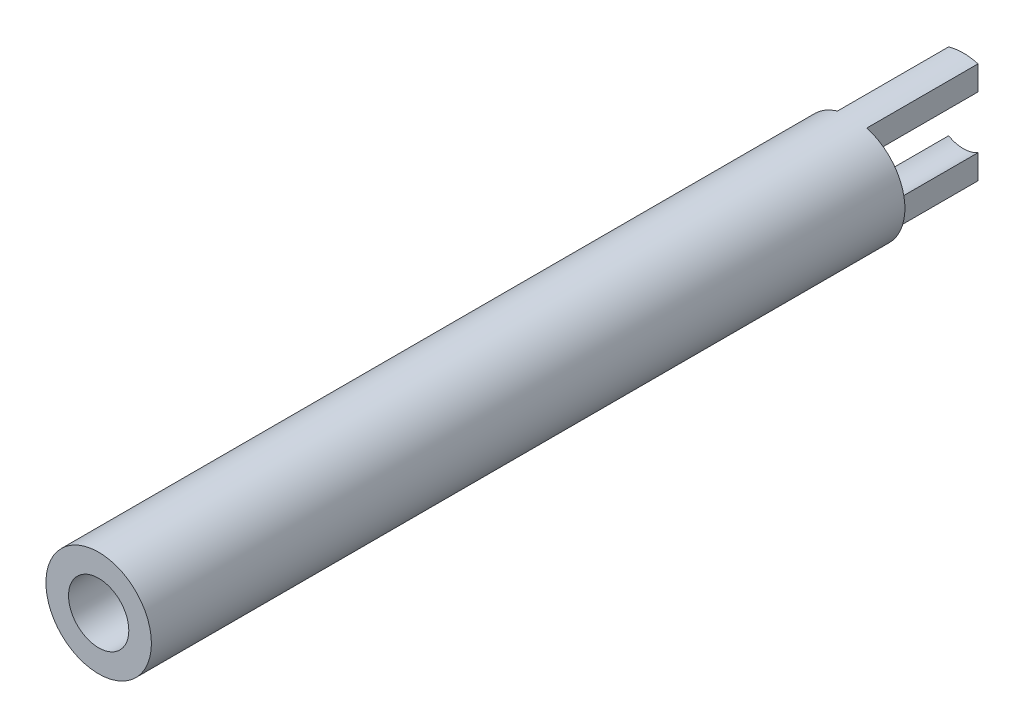
ISO-10303-21;
HEADER;
FILE_DESCRIPTION(('STEP AP214'),'2;1');
FILE_NAME('part.step','',(''),(''),'','','');
FILE_SCHEMA(('AUTOMOTIVE_DESIGN { 1 0 10303 214 1 1 1 1 }'));
ENDSEC;
DATA;
#1=APPLICATION_CONTEXT('core data for automotive mechanical design processes');
#2=APPLICATION_PROTOCOL_DEFINITION('international standard','automotive_design',2000,#1);
#3=PRODUCT_CONTEXT('',#1,'mechanical');
#4=PRODUCT('Part','Part','',(#3));
#5=PRODUCT_RELATED_PRODUCT_CATEGORY('part','',(#4));
#6=PRODUCT_DEFINITION_FORMATION('','',#4);
#7=PRODUCT_DEFINITION_CONTEXT('part definition',#1,'design');
#8=PRODUCT_DEFINITION('design','',#6,#7);
#9=PRODUCT_DEFINITION_SHAPE('','',#8);
#10=(LENGTH_UNIT() NAMED_UNIT(*) SI_UNIT(.MILLI.,.METRE.));
#11=(NAMED_UNIT(*) PLANE_ANGLE_UNIT() SI_UNIT($,.RADIAN.));
#12=(NAMED_UNIT(*) SI_UNIT($,.STERADIAN.) SOLID_ANGLE_UNIT());
#13=UNCERTAINTY_MEASURE_WITH_UNIT(LENGTH_MEASURE(1.E-05),#10,'distance_accuracy_value','');
#14=(GEOMETRIC_REPRESENTATION_CONTEXT(3) GLOBAL_UNCERTAINTY_ASSIGNED_CONTEXT((#13)) GLOBAL_UNIT_ASSIGNED_CONTEXT((#10,
#11,#12)) REPRESENTATION_CONTEXT('',''));
#15=CARTESIAN_POINT('',(0.,0.,0.));
#16=DIRECTION('',(0.,0.,1.));
#17=DIRECTION('',(1.,0.,0.));
#18=AXIS2_PLACEMENT_3D('',#15,#16,#17);
#19=CARTESIAN_POINT('',(0.,0.,7.5));
#20=DIRECTION('',(0.,0.,1.));
#21=DIRECTION('',(1.,0.,0.));
#22=AXIS2_PLACEMENT_3D('',#19,#20,#21);
#23=PLANE('',#22);
#24=CARTESIAN_POINT('',(0.,0.,7.5));
#25=DIRECTION('',(0.,0.,1.));
#26=DIRECTION('',(1.,0.,0.));
#27=AXIS2_PLACEMENT_3D('',#24,#25,#26);
#28=CIRCLE('',#27,4.);
#29=CARTESIAN_POINT('',(-1.95,3.49249194702006,7.5));
#30=VERTEX_POINT('',#29);
#31=CARTESIAN_POINT('',(-1.95,-3.49249194702006,7.5));
#32=VERTEX_POINT('',#31);
#33=EDGE_CURVE('E119',#30,#32,#28,.T.);
#34=ORIENTED_EDGE('',*,*,#33,.T.);
#35=DIRECTION('',(0.,-1.,0.));
#36=VECTOR('',#35,1.);
#37=CARTESIAN_POINT('',(-1.95,-3.49249194702006,7.5));
#38=LINE('',#37,#36);
#39=CARTESIAN_POINT('',(-1.95,-6.72290859673103,7.5));
#40=VERTEX_POINT('',#39);
#41=EDGE_CURVE('E66',#32,#40,#38,.T.);
#42=ORIENTED_EDGE('',*,*,#41,.T.);
#43=CARTESIAN_POINT('',(0.,0.,7.5));
#44=DIRECTION('',(0.,0.,1.));
#45=DIRECTION('',(1.,0.,0.));
#46=AXIS2_PLACEMENT_3D('',#43,#44,#45);
#47=CIRCLE('',#46,7.);
#48=CARTESIAN_POINT('',(-1.95,6.72290859673103,7.5));
#49=VERTEX_POINT('',#48);
#50=EDGE_CURVE('E47',#49,#40,#47,.T.);
#51=ORIENTED_EDGE('',*,*,#50,.F.);
#52=DIRECTION('',(0.,-1.,0.));
#53=VECTOR('',#52,1.);
#54=CARTESIAN_POINT('',(-1.95,6.72290859673103,7.5));
#55=LINE('',#54,#53);
#56=EDGE_CURVE('E126',#49,#30,#55,.T.);
#57=ORIENTED_EDGE('',*,*,#56,.T.);
#58=EDGE_LOOP('',(#34,#42,#51,#57));
#59=FACE_BOUND('',#58,.T.);
#60=ADVANCED_FACE('F43',(#59),#23,.F.);
#61=CARTESIAN_POINT('',(0.,0.,107.5));
#62=DIRECTION('',(0.,0.,1.));
#63=DIRECTION('',(1.,0.,0.));
#64=AXIS2_PLACEMENT_3D('',#61,#62,#63);
#65=PLANE('',#64);
#66=CARTESIAN_POINT('',(0.,0.,107.5));
#67=DIRECTION('',(0.,0.,1.));
#68=DIRECTION('',(1.,0.,0.));
#69=AXIS2_PLACEMENT_3D('',#66,#67,#68);
#70=CIRCLE('',#69,7.);
#71=CARTESIAN_POINT('',(7.,0.,107.5));
#72=VERTEX_POINT('',#71);
#73=EDGE_CURVE('E11',#72,#72,#70,.T.);
#74=ORIENTED_EDGE('',*,*,#73,.T.);
#75=EDGE_LOOP('',(#74));
#76=FACE_BOUND('',#75,.T.);
#77=CARTESIAN_POINT('',(0.,0.,107.5));
#78=DIRECTION('',(0.,0.,1.));
#79=DIRECTION('',(1.,0.,0.));
#80=AXIS2_PLACEMENT_3D('',#77,#78,#79);
#81=CIRCLE('',#80,4.);
#82=CARTESIAN_POINT('',(4.,0.,107.5));
#83=VERTEX_POINT('',#82);
#84=EDGE_CURVE('E174',#83,#83,#81,.T.);
#85=ORIENTED_EDGE('',*,*,#84,.F.);
#86=EDGE_LOOP('',(#85));
#87=FACE_BOUND('',#86,.T.);
#88=ADVANCED_FACE('F194',(#76,#87),#65,.T.);
#89=CARTESIAN_POINT('',(1.95,-6.72290859673103,7.5));
#90=VERTEX_POINT('',#89);
#91=CARTESIAN_POINT('',(1.95,6.72290859673103,7.5));
#92=VERTEX_POINT('',#91);
#93=EDGE_CURVE('E58',#90,#92,#47,.T.);
#94=ORIENTED_EDGE('',*,*,#93,.F.);
#95=DIRECTION('',(0.,1.,0.));
#96=VECTOR('',#95,1.);
#97=CARTESIAN_POINT('',(1.95,-3.49249194702006,7.5));
#98=LINE('',#97,#96);
#99=CARTESIAN_POINT('',(1.95,-3.49249194702006,7.5));
#100=VERTEX_POINT('',#99);
#101=EDGE_CURVE('E123',#90,#100,#98,.T.);
#102=ORIENTED_EDGE('',*,*,#101,.T.);
#103=CARTESIAN_POINT('',(1.95,3.49249194702006,7.5));
#104=VERTEX_POINT('',#103);
#105=EDGE_CURVE('E109',#100,#104,#28,.T.);
#106=ORIENTED_EDGE('',*,*,#105,.T.);
#107=DIRECTION('',(0.,1.,0.));
#108=VECTOR('',#107,1.);
#109=CARTESIAN_POINT('',(1.95,6.72290859673103,7.5));
#110=LINE('',#109,#108);
#111=EDGE_CURVE('E156',#104,#92,#110,.T.);
#112=ORIENTED_EDGE('',*,*,#111,.T.);
#113=EDGE_LOOP('',(#94,#102,#106,#112));
#114=FACE_BOUND('',#113,.T.);
#115=ADVANCED_FACE('F124',(#114),#23,.F.);
#116=CARTESIAN_POINT('',(0.,0.,107.5));
#117=DIRECTION('',(0.,0.,-1.));
#118=DIRECTION('',(-1.,0.,0.));
#119=AXIS2_PLACEMENT_3D('',#116,#117,#118);
#120=CYLINDRICAL_SURFACE('',#119,7.);
#121=ORIENTED_EDGE('',*,*,#73,.F.);
#122=EDGE_LOOP('',(#121));
#123=FACE_BOUND('',#122,.T.);
#124=ORIENTED_EDGE('',*,*,#50,.T.);
#125=DIRECTION('',(0.,0.,1.));
#126=VECTOR('',#125,1.);
#127=CARTESIAN_POINT('',(-1.95,-6.72290859673103,-7.25));
#128=LINE('',#127,#126);
#129=CARTESIAN_POINT('',(-1.95,-6.72290859673103,-7.25));
#130=VERTEX_POINT('',#129);
#131=EDGE_CURVE('E138',#130,#40,#128,.T.);
#132=ORIENTED_EDGE('',*,*,#131,.F.);
#133=CARTESIAN_POINT('',(0.,0.,-7.25));
#134=DIRECTION('',(0.,0.,1.));
#135=DIRECTION('',(1.,0.,0.));
#136=AXIS2_PLACEMENT_3D('',#133,#134,#135);
#137=CIRCLE('',#136,7.);
#138=CARTESIAN_POINT('',(1.95,-6.72290859673103,-7.25));
#139=VERTEX_POINT('',#138);
#140=EDGE_CURVE('E143',#130,#139,#137,.T.);
#141=ORIENTED_EDGE('',*,*,#140,.T.);
#142=DIRECTION('',(0.,0.,1.));
#143=VECTOR('',#142,1.);
#144=CARTESIAN_POINT('',(1.95,-6.72290859673103,-7.25));
#145=LINE('',#144,#143);
#146=EDGE_CURVE('E132',#139,#90,#145,.T.);
#147=ORIENTED_EDGE('',*,*,#146,.T.);
#148=ORIENTED_EDGE('',*,*,#93,.T.);
#149=DIRECTION('',(0.,0.,1.));
#150=VECTOR('',#149,1.);
#151=CARTESIAN_POINT('',(1.95,6.72290859673103,-7.25));
#152=LINE('',#151,#150);
#153=CARTESIAN_POINT('',(1.95,6.72290859673103,-7.25));
#154=VERTEX_POINT('',#153);
#155=EDGE_CURVE('E120',#154,#92,#152,.T.);
#156=ORIENTED_EDGE('',*,*,#155,.F.);
#157=CARTESIAN_POINT('',(0.,0.,-7.25));
#158=DIRECTION('',(0.,0.,1.));
#159=DIRECTION('',(1.,0.,0.));
#160=AXIS2_PLACEMENT_3D('',#157,#158,#159);
#161=CIRCLE('',#160,7.);
#162=CARTESIAN_POINT('',(-1.95,6.72290859673103,-7.25));
#163=VERTEX_POINT('',#162);
#164=EDGE_CURVE('E152',#154,#163,#161,.T.);
#165=ORIENTED_EDGE('',*,*,#164,.T.);
#166=DIRECTION('',(0.,0.,1.));
#167=VECTOR('',#166,1.);
#168=CARTESIAN_POINT('',(-1.95,6.72290859673103,-7.25));
#169=LINE('',#168,#167);
#170=EDGE_CURVE('E164',#163,#49,#169,.T.);
#171=ORIENTED_EDGE('',*,*,#170,.T.);
#172=EDGE_LOOP('',(#124,#132,#141,#147,#148,#156,#165,#171));
#173=FACE_BOUND('',#172,.T.);
#174=ADVANCED_FACE('F45',(#123,#173),#120,.T.);
#175=CARTESIAN_POINT('',(0.,0.,107.5));
#176=DIRECTION('',(0.,0.,-1.));
#177=DIRECTION('',(-1.,0.,0.));
#178=AXIS2_PLACEMENT_3D('',#175,#176,#177);
#179=CYLINDRICAL_SURFACE('',#178,4.);
#180=ORIENTED_EDGE('',*,*,#84,.T.);
#181=EDGE_LOOP('',(#180));
#182=FACE_BOUND('',#181,.T.);
#183=ORIENTED_EDGE('',*,*,#33,.F.);
#184=DIRECTION('',(0.,0.,1.));
#185=VECTOR('',#184,1.);
#186=CARTESIAN_POINT('',(-1.95,3.49249194702006,-7.25));
#187=LINE('',#186,#185);
#188=CARTESIAN_POINT('',(-1.95,3.49249194702006,-7.25));
#189=VERTEX_POINT('',#188);
#190=EDGE_CURVE('E171',#189,#30,#187,.T.);
#191=ORIENTED_EDGE('',*,*,#190,.F.);
#192=CARTESIAN_POINT('',(0.,0.,-7.25));
#193=DIRECTION('',(0.,0.,-1.));
#194=DIRECTION('',(1.,0.,0.));
#195=AXIS2_PLACEMENT_3D('',#192,#193,#194);
#196=CIRCLE('',#195,4.);
#197=CARTESIAN_POINT('',(1.95,3.49249194702006,-7.25));
#198=VERTEX_POINT('',#197);
#199=EDGE_CURVE('E159',#189,#198,#196,.T.);
#200=ORIENTED_EDGE('',*,*,#199,.T.);
#201=DIRECTION('',(0.,0.,1.));
#202=VECTOR('',#201,1.);
#203=CARTESIAN_POINT('',(1.95,3.49249194702006,-7.25));
#204=LINE('',#203,#202);
#205=EDGE_CURVE('E117',#198,#104,#204,.T.);
#206=ORIENTED_EDGE('',*,*,#205,.T.);
#207=ORIENTED_EDGE('',*,*,#105,.F.);
#208=DIRECTION('',(0.,0.,1.));
#209=VECTOR('',#208,1.);
#210=CARTESIAN_POINT('',(1.95,-3.49249194702006,-7.25));
#211=LINE('',#210,#209);
#212=CARTESIAN_POINT('',(1.95,-3.49249194702006,-7.25));
#213=VERTEX_POINT('',#212);
#214=EDGE_CURVE('E114',#213,#100,#211,.T.);
#215=ORIENTED_EDGE('',*,*,#214,.F.);
#216=CARTESIAN_POINT('',(0.,0.,-7.25));
#217=DIRECTION('',(0.,0.,-1.));
#218=DIRECTION('',(1.,0.,0.));
#219=AXIS2_PLACEMENT_3D('',#216,#217,#218);
#220=CIRCLE('',#219,4.);
#221=CARTESIAN_POINT('',(-1.95,-3.49249194702006,-7.25));
#222=VERTEX_POINT('',#221);
#223=EDGE_CURVE('E147',#213,#222,#220,.T.);
#224=ORIENTED_EDGE('',*,*,#223,.T.);
#225=DIRECTION('',(0.,0.,1.));
#226=VECTOR('',#225,1.);
#227=CARTESIAN_POINT('',(-1.95,-3.49249194702006,-7.25));
#228=LINE('',#227,#226);
#229=EDGE_CURVE('E133',#222,#32,#228,.T.);
#230=ORIENTED_EDGE('',*,*,#229,.T.);
#231=EDGE_LOOP('',(#183,#191,#200,#206,#207,#215,#224,#230));
#232=FACE_BOUND('',#231,.T.);
#233=ADVANCED_FACE('F111',(#182,#232),#179,.F.);
#234=CARTESIAN_POINT('',(1.95,6.72290859673103,-7.25));
#235=DIRECTION('',(1.,0.,0.));
#236=DIRECTION('',(0.,0.,-1.));
#237=AXIS2_PLACEMENT_3D('',#234,#235,#236);
#238=PLANE('',#237);
#239=ORIENTED_EDGE('',*,*,#111,.F.);
#240=ORIENTED_EDGE('',*,*,#205,.F.);
#241=DIRECTION('',(0.,1.,0.));
#242=VECTOR('',#241,1.);
#243=CARTESIAN_POINT('',(1.95,6.72290859673103,-7.25));
#244=LINE('',#243,#242);
#245=EDGE_CURVE('E161',#198,#154,#244,.T.);
#246=ORIENTED_EDGE('',*,*,#245,.T.);
#247=ORIENTED_EDGE('',*,*,#155,.T.);
#248=EDGE_LOOP('',(#239,#240,#246,#247));
#249=FACE_BOUND('',#248,.T.);
#250=ADVANCED_FACE('F213',(#249),#238,.T.);
#251=CARTESIAN_POINT('',(-1.95,6.72290859673103,-7.25));
#252=DIRECTION('',(-1.,0.,0.));
#253=DIRECTION('',(0.,0.,1.));
#254=AXIS2_PLACEMENT_3D('',#251,#252,#253);
#255=PLANE('',#254);
#256=ORIENTED_EDGE('',*,*,#56,.F.);
#257=ORIENTED_EDGE('',*,*,#170,.F.);
#258=DIRECTION('',(0.,-1.,0.));
#259=VECTOR('',#258,1.);
#260=CARTESIAN_POINT('',(-1.95,6.72290859673103,-7.25));
#261=LINE('',#260,#259);
#262=EDGE_CURVE('E155',#163,#189,#261,.T.);
#263=ORIENTED_EDGE('',*,*,#262,.T.);
#264=ORIENTED_EDGE('',*,*,#190,.T.);
#265=EDGE_LOOP('',(#256,#257,#263,#264));
#266=FACE_BOUND('',#265,.T.);
#267=ADVANCED_FACE('F223',(#266),#255,.T.);
#268=CARTESIAN_POINT('',(0.,0.,-7.25));
#269=DIRECTION('',(0.,0.,1.));
#270=DIRECTION('',(1.,0.,0.));
#271=AXIS2_PLACEMENT_3D('',#268,#269,#270);
#272=PLANE('',#271);
#273=ORIENTED_EDGE('',*,*,#164,.F.);
#274=ORIENTED_EDGE('',*,*,#245,.F.);
#275=ORIENTED_EDGE('',*,*,#199,.F.);
#276=ORIENTED_EDGE('',*,*,#262,.F.);
#277=EDGE_LOOP('',(#273,#274,#275,#276));
#278=FACE_BOUND('',#277,.T.);
#279=ADVANCED_FACE('F228',(#278),#272,.F.);
#280=CARTESIAN_POINT('',(-1.95,-3.49249194702006,-7.25));
#281=DIRECTION('',(-1.,0.,0.));
#282=DIRECTION('',(0.,0.,1.));
#283=AXIS2_PLACEMENT_3D('',#280,#281,#282);
#284=PLANE('',#283);
#285=ORIENTED_EDGE('',*,*,#41,.F.);
#286=ORIENTED_EDGE('',*,*,#229,.F.);
#287=DIRECTION('',(0.,-1.,0.));
#288=VECTOR('',#287,1.);
#289=CARTESIAN_POINT('',(-1.95,-3.49249194702006,-7.25));
#290=LINE('',#289,#288);
#291=EDGE_CURVE('E135',#222,#130,#290,.T.);
#292=ORIENTED_EDGE('',*,*,#291,.T.);
#293=ORIENTED_EDGE('',*,*,#131,.T.);
#294=EDGE_LOOP('',(#285,#286,#292,#293));
#295=FACE_BOUND('',#294,.T.);
#296=ADVANCED_FACE('F179',(#295),#284,.T.);
#297=CARTESIAN_POINT('',(1.95,-3.49249194702006,-7.25));
#298=DIRECTION('',(1.,0.,0.));
#299=DIRECTION('',(0.,0.,-1.));
#300=AXIS2_PLACEMENT_3D('',#297,#298,#299);
#301=PLANE('',#300);
#302=ORIENTED_EDGE('',*,*,#101,.F.);
#303=ORIENTED_EDGE('',*,*,#146,.F.);
#304=DIRECTION('',(0.,1.,0.));
#305=VECTOR('',#304,1.);
#306=CARTESIAN_POINT('',(1.95,-3.49249194702006,-7.25));
#307=LINE('',#306,#305);
#308=EDGE_CURVE('E131',#139,#213,#307,.T.);
#309=ORIENTED_EDGE('',*,*,#308,.T.);
#310=ORIENTED_EDGE('',*,*,#214,.T.);
#311=EDGE_LOOP('',(#302,#303,#309,#310));
#312=FACE_BOUND('',#311,.T.);
#313=ADVANCED_FACE('F129',(#312),#301,.T.);
#314=CARTESIAN_POINT('',(0.,0.,-7.25));
#315=DIRECTION('',(0.,0.,1.));
#316=DIRECTION('',(1.,0.,0.));
#317=AXIS2_PLACEMENT_3D('',#314,#315,#316);
#318=PLANE('',#317);
#319=ORIENTED_EDGE('',*,*,#140,.F.);
#320=ORIENTED_EDGE('',*,*,#291,.F.);
#321=ORIENTED_EDGE('',*,*,#223,.F.);
#322=ORIENTED_EDGE('',*,*,#308,.F.);
#323=EDGE_LOOP('',(#319,#320,#321,#322));
#324=FACE_BOUND('',#323,.T.);
#325=ADVANCED_FACE('F183',(#324),#318,.F.);
#326=CLOSED_SHELL('',(#60,#88,#115,#174,#233,#250,#267,#279,#296,#313,#325));
#327=MANIFOLD_SOLID_BREP('B2',#326);
#328=ADVANCED_BREP_SHAPE_REPRESENTATION('',(#18,#327),#14);
#329=SHAPE_DEFINITION_REPRESENTATION(#9,#328);
ENDSEC;
END-ISO-10303-21;
